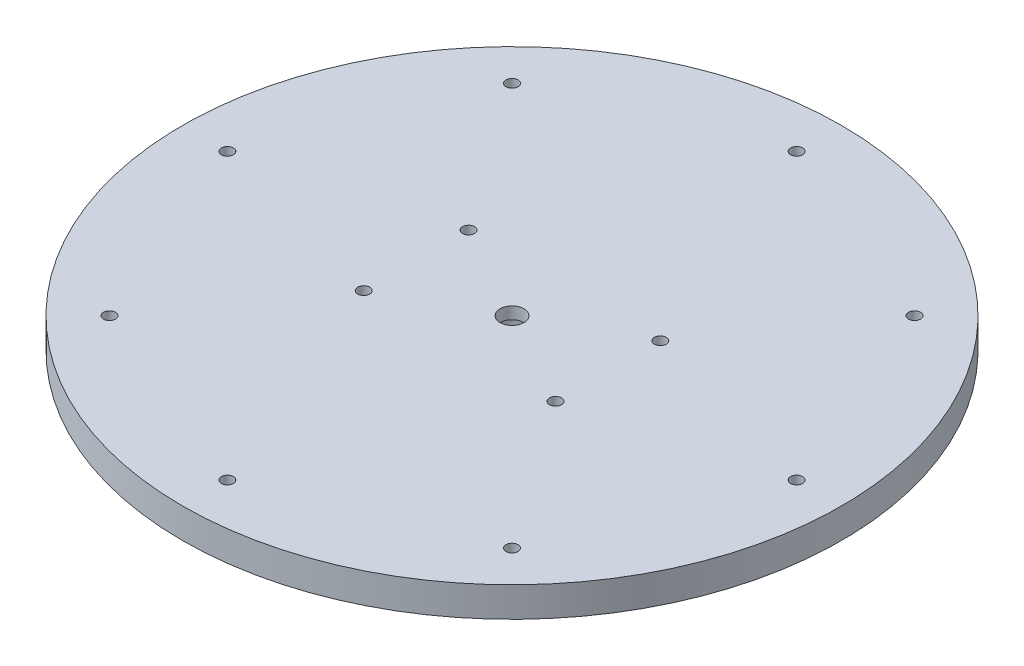
ISO-10303-21;
HEADER;
FILE_DESCRIPTION(('STEP AP214'),'2;1');
FILE_NAME('part.step','',(''),(''),'','','');
FILE_SCHEMA(('AUTOMOTIVE_DESIGN { 1 0 10303 214 1 1 1 1 }'));
ENDSEC;
DATA;
#1=APPLICATION_CONTEXT('core data for automotive mechanical design processes');
#2=APPLICATION_PROTOCOL_DEFINITION('international standard','automotive_design',2000,#1);
#3=PRODUCT_CONTEXT('',#1,'mechanical');
#4=PRODUCT('Part','Part','',(#3));
#5=PRODUCT_RELATED_PRODUCT_CATEGORY('part','',(#4));
#6=PRODUCT_DEFINITION_FORMATION('','',#4);
#7=PRODUCT_DEFINITION_CONTEXT('part definition',#1,'design');
#8=PRODUCT_DEFINITION('design','',#6,#7);
#9=PRODUCT_DEFINITION_SHAPE('','',#8);
#10=(LENGTH_UNIT() NAMED_UNIT(*) SI_UNIT(.MILLI.,.METRE.));
#11=(NAMED_UNIT(*) PLANE_ANGLE_UNIT() SI_UNIT($,.RADIAN.));
#12=(NAMED_UNIT(*) SI_UNIT($,.STERADIAN.) SOLID_ANGLE_UNIT());
#13=UNCERTAINTY_MEASURE_WITH_UNIT(LENGTH_MEASURE(1.E-05),#10,'distance_accuracy_value','');
#14=(GEOMETRIC_REPRESENTATION_CONTEXT(3) GLOBAL_UNCERTAINTY_ASSIGNED_CONTEXT((#13)) GLOBAL_UNIT_ASSIGNED_CONTEXT((#10,
#11,#12)) REPRESENTATION_CONTEXT('',''));
#15=CARTESIAN_POINT('',(0.,0.,0.));
#16=DIRECTION('',(0.,0.,1.));
#17=DIRECTION('',(1.,0.,0.));
#18=AXIS2_PLACEMENT_3D('',#15,#16,#17);
#19=CARTESIAN_POINT('',(0.,10.,0.));
#20=DIRECTION('',(0.,-1.,0.));
#21=DIRECTION('',(0.,0.,-1.));
#22=AXIS2_PLACEMENT_3D('',#19,#20,#21);
#23=CYLINDRICAL_SURFACE('',#22,110.);
#24=CARTESIAN_POINT('',(0.,10.,0.));
#25=DIRECTION('',(0.,1.,0.));
#26=DIRECTION('',(0.,0.,1.));
#27=AXIS2_PLACEMENT_3D('',#24,#25,#26);
#28=CIRCLE('',#27,110.);
#29=CARTESIAN_POINT('',(0.,10.,110.));
#30=VERTEX_POINT('',#29);
#31=EDGE_CURVE('E10',#30,#30,#28,.T.);
#32=ORIENTED_EDGE('',*,*,#31,.F.);
#33=EDGE_LOOP('',(#32));
#34=FACE_BOUND('',#33,.T.);
#35=CARTESIAN_POINT('',(0.,0.,0.));
#36=DIRECTION('',(0.,1.,0.));
#37=DIRECTION('',(0.,0.,1.));
#38=AXIS2_PLACEMENT_3D('',#35,#36,#37);
#39=CIRCLE('',#38,110.);
#40=CARTESIAN_POINT('',(0.,0.,110.));
#41=VERTEX_POINT('',#40);
#42=EDGE_CURVE('E42',#41,#41,#39,.T.);
#43=ORIENTED_EDGE('',*,*,#42,.T.);
#44=EDGE_LOOP('',(#43));
#45=FACE_BOUND('',#44,.T.);
#46=ADVANCED_FACE('F39',(#34,#45),#23,.T.);
#47=CARTESIAN_POINT('',(0.,10.,0.));
#48=DIRECTION('',(0.,1.,0.));
#49=DIRECTION('',(0.,0.,1.));
#50=AXIS2_PLACEMENT_3D('',#47,#48,#49);
#51=PLANE('',#50);
#52=CARTESIAN_POINT('',(0.,10.,95.));
#53=DIRECTION('',(0.,-1.,0.));
#54=DIRECTION('',(0.,0.,-1.));
#55=AXIS2_PLACEMENT_3D('',#52,#53,#54);
#56=CIRCLE('',#55,2.);
#57=CARTESIAN_POINT('',(0.,10.,93.));
#58=VERTEX_POINT('',#57);
#59=EDGE_CURVE('E84',#58,#58,#56,.T.);
#60=ORIENTED_EDGE('',*,*,#59,.T.);
#61=EDGE_LOOP('',(#60));
#62=FACE_BOUND('',#61,.T.);
#63=CARTESIAN_POINT('',(67.1751442127244,10.,67.1751442127277));
#64=DIRECTION('',(0.,-1.,0.));
#65=DIRECTION('',(0.,0.,-1.));
#66=AXIS2_PLACEMENT_3D('',#63,#64,#65);
#67=CIRCLE('',#66,2.00000000000076);
#68=CARTESIAN_POINT('',(67.1751442127244,10.,65.175144212727));
#69=VERTEX_POINT('',#68);
#70=EDGE_CURVE('E126',#69,#69,#67,.T.);
#71=ORIENTED_EDGE('',*,*,#70,.T.);
#72=EDGE_LOOP('',(#71));
#73=FACE_BOUND('',#72,.T.);
#74=CARTESIAN_POINT('',(95.0000000000081,10.,8.08273597077729E-12));
#75=DIRECTION('',(0.,-1.,0.));
#76=DIRECTION('',(0.,0.,-1.));
#77=AXIS2_PLACEMENT_3D('',#74,#75,#76);
#78=CIRCLE('',#77,2.00000000000569);
#79=CARTESIAN_POINT('',(95.0000000000081,10.,-1.99999999999761));
#80=VERTEX_POINT('',#79);
#81=EDGE_CURVE('E120',#80,#80,#78,.T.);
#82=ORIENTED_EDGE('',*,*,#81,.T.);
#83=EDGE_LOOP('',(#82));
#84=FACE_BOUND('',#83,.T.);
#85=CARTESIAN_POINT('',(67.1751442127358,10.,-67.1751442127163));
#86=DIRECTION('',(0.,-1.,0.));
#87=DIRECTION('',(0.,0.,-1.));
#88=AXIS2_PLACEMENT_3D('',#85,#86,#87);
#89=CIRCLE('',#88,2.000000000012);
#90=CARTESIAN_POINT('',(67.1751442127358,10.,-69.1751442127283));
#91=VERTEX_POINT('',#90);
#92=EDGE_CURVE('E114',#91,#91,#89,.T.);
#93=ORIENTED_EDGE('',*,*,#92,.T.);
#94=EDGE_LOOP('',(#93));
#95=FACE_BOUND('',#94,.T.);
#96=CARTESIAN_POINT('',(1.61654719415546E-11,10.,-95.));
#97=DIRECTION('',(0.,-1.,0.));
#98=DIRECTION('',(0.,0.,-1.));
#99=AXIS2_PLACEMENT_3D('',#96,#97,#98);
#100=CIRCLE('',#99,2.00000000001609);
#101=CARTESIAN_POINT('',(1.61654719415546E-11,10.,-97.0000000000161));
#102=VERTEX_POINT('',#101);
#103=EDGE_CURVE('E108',#102,#102,#100,.T.);
#104=ORIENTED_EDGE('',*,*,#103,.T.);
#105=EDGE_LOOP('',(#104));
#106=FACE_BOUND('',#105,.T.);
#107=CARTESIAN_POINT('',(-67.1751442127082,10.,-67.1751442127277));
#108=DIRECTION('',(0.,-1.,0.));
#109=DIRECTION('',(0.,0.,-1.));
#110=AXIS2_PLACEMENT_3D('',#107,#108,#109);
#111=CIRCLE('',#110,2.00000000001567);
#112=CARTESIAN_POINT('',(-67.1751442127082,10.,-69.1751442127434));
#113=VERTEX_POINT('',#112);
#114=EDGE_CURVE('E102',#113,#113,#111,.T.);
#115=ORIENTED_EDGE('',*,*,#114,.T.);
#116=EDGE_LOOP('',(#115));
#117=FACE_BOUND('',#116,.T.);
#118=CARTESIAN_POINT('',(-94.9999999999919,10.,-8.09437011536919E-12));
#119=DIRECTION('',(0.,-1.,0.));
#120=DIRECTION('',(0.,0.,-1.));
#121=AXIS2_PLACEMENT_3D('',#118,#119,#120);
#122=CIRCLE('',#121,2.00000000001106);
#123=CARTESIAN_POINT('',(-94.9999999999919,10.,-2.00000000001915));
#124=VERTEX_POINT('',#123);
#125=EDGE_CURVE('E96',#124,#124,#122,.T.);
#126=ORIENTED_EDGE('',*,*,#125,.T.);
#127=EDGE_LOOP('',(#126));
#128=FACE_BOUND('',#127,.T.);
#129=CARTESIAN_POINT('',(-67.1751442127197,10.,67.1751442127163));
#130=DIRECTION('',(0.,-1.,0.));
#131=DIRECTION('',(0.,0.,-1.));
#132=AXIS2_PLACEMENT_3D('',#129,#130,#131);
#133=CIRCLE('',#132,2.00000000000508);
#134=CARTESIAN_POINT('',(-67.1751442127197,10.,65.1751442127112));
#135=VERTEX_POINT('',#134);
#136=EDGE_CURVE('E90',#135,#135,#133,.T.);
#137=ORIENTED_EDGE('',*,*,#136,.T.);
#138=EDGE_LOOP('',(#137));
#139=FACE_BOUND('',#138,.T.);
#140=CARTESIAN_POINT('',(-32.,10.,-17.5));
#141=DIRECTION('',(0.,-1.,0.));
#142=DIRECTION('',(0.,0.,-1.));
#143=AXIS2_PLACEMENT_3D('',#140,#141,#142);
#144=CIRCLE('',#143,2.);
#145=CARTESIAN_POINT('',(-32.,10.,-19.5));
#146=VERTEX_POINT('',#145);
#147=EDGE_CURVE('E76',#146,#146,#144,.T.);
#148=ORIENTED_EDGE('',*,*,#147,.T.);
#149=EDGE_LOOP('',(#148));
#150=FACE_BOUND('',#149,.T.);
#151=CARTESIAN_POINT('',(32.,10.,17.5));
#152=DIRECTION('',(0.,-1.,0.));
#153=DIRECTION('',(0.,0.,-1.));
#154=AXIS2_PLACEMENT_3D('',#151,#152,#153);
#155=CIRCLE('',#154,2.);
#156=CARTESIAN_POINT('',(32.,10.,15.5));
#157=VERTEX_POINT('',#156);
#158=EDGE_CURVE('E69',#157,#157,#155,.T.);
#159=ORIENTED_EDGE('',*,*,#158,.T.);
#160=EDGE_LOOP('',(#159));
#161=FACE_BOUND('',#160,.T.);
#162=CARTESIAN_POINT('',(32.,10.,-17.5));
#163=DIRECTION('',(0.,-1.,0.));
#164=DIRECTION('',(0.,0.,-1.));
#165=AXIS2_PLACEMENT_3D('',#162,#163,#164);
#166=CIRCLE('',#165,2.);
#167=CARTESIAN_POINT('',(32.,10.,-19.5));
#168=VERTEX_POINT('',#167);
#169=EDGE_CURVE('E81',#168,#168,#166,.T.);
#170=ORIENTED_EDGE('',*,*,#169,.T.);
#171=EDGE_LOOP('',(#170));
#172=FACE_BOUND('',#171,.T.);
#173=CARTESIAN_POINT('',(-32.,10.,17.5));
#174=DIRECTION('',(0.,-1.,0.));
#175=DIRECTION('',(0.,0.,-1.));
#176=AXIS2_PLACEMENT_3D('',#173,#174,#175);
#177=CIRCLE('',#176,2.);
#178=CARTESIAN_POINT('',(-32.,10.,15.5));
#179=VERTEX_POINT('',#178);
#180=EDGE_CURVE('E60',#179,#179,#177,.T.);
#181=ORIENTED_EDGE('',*,*,#180,.T.);
#182=EDGE_LOOP('',(#181));
#183=FACE_BOUND('',#182,.T.);
#184=CARTESIAN_POINT('',(0.,10.,0.));
#185=DIRECTION('',(0.,-1.,0.));
#186=DIRECTION('',(0.,0.,-1.));
#187=AXIS2_PLACEMENT_3D('',#184,#185,#186);
#188=CIRCLE('',#187,4.);
#189=CARTESIAN_POINT('',(0.,10.,-4.));
#190=VERTEX_POINT('',#189);
#191=EDGE_CURVE('E54',#190,#190,#188,.T.);
#192=ORIENTED_EDGE('',*,*,#191,.T.);
#193=EDGE_LOOP('',(#192));
#194=FACE_BOUND('',#193,.T.);
#195=ORIENTED_EDGE('',*,*,#31,.T.);
#196=EDGE_LOOP('',(#195));
#197=FACE_BOUND('',#196,.T.);
#198=ADVANCED_FACE('F135',(#62,#73,#84,#95,#106,#117,#128,#139,#150,#161,#172,#183,#194,#197),
#51,.T.);
#199=CARTESIAN_POINT('',(0.,0.,0.));
#200=DIRECTION('',(0.,1.,0.));
#201=DIRECTION('',(0.,0.,1.));
#202=AXIS2_PLACEMENT_3D('',#199,#200,#201);
#203=PLANE('',#202);
#204=CARTESIAN_POINT('',(0.,0.,95.));
#205=DIRECTION('',(0.,-1.,0.));
#206=DIRECTION('',(0.,0.,-1.));
#207=AXIS2_PLACEMENT_3D('',#204,#205,#206);
#208=CIRCLE('',#207,2.);
#209=CARTESIAN_POINT('',(0.,0.,93.));
#210=VERTEX_POINT('',#209);
#211=EDGE_CURVE('E129',#210,#210,#208,.T.);
#212=ORIENTED_EDGE('',*,*,#211,.F.);
#213=EDGE_LOOP('',(#212));
#214=FACE_BOUND('',#213,.T.);
#215=CARTESIAN_POINT('',(67.1751442127244,0.,67.1751442127277));
#216=DIRECTION('',(0.,-1.,0.));
#217=DIRECTION('',(0.,0.,-1.));
#218=AXIS2_PLACEMENT_3D('',#215,#216,#217);
#219=CIRCLE('',#218,2.00000000000076);
#220=CARTESIAN_POINT('',(67.1751442127244,0.,65.175144212727));
#221=VERTEX_POINT('',#220);
#222=EDGE_CURVE('E123',#221,#221,#219,.T.);
#223=ORIENTED_EDGE('',*,*,#222,.F.);
#224=EDGE_LOOP('',(#223));
#225=FACE_BOUND('',#224,.T.);
#226=CARTESIAN_POINT('',(95.0000000000081,0.,8.08273597077729E-12));
#227=DIRECTION('',(0.,-1.,0.));
#228=DIRECTION('',(0.,0.,-1.));
#229=AXIS2_PLACEMENT_3D('',#226,#227,#228);
#230=CIRCLE('',#229,2.00000000000569);
#231=CARTESIAN_POINT('',(95.0000000000081,0.,-1.99999999999761));
#232=VERTEX_POINT('',#231);
#233=EDGE_CURVE('E117',#232,#232,#230,.T.);
#234=ORIENTED_EDGE('',*,*,#233,.F.);
#235=EDGE_LOOP('',(#234));
#236=FACE_BOUND('',#235,.T.);
#237=CARTESIAN_POINT('',(67.1751442127358,0.,-67.1751442127163));
#238=DIRECTION('',(0.,-1.,0.));
#239=DIRECTION('',(0.,0.,-1.));
#240=AXIS2_PLACEMENT_3D('',#237,#238,#239);
#241=CIRCLE('',#240,2.000000000012);
#242=CARTESIAN_POINT('',(67.1751442127358,0.,-69.1751442127283));
#243=VERTEX_POINT('',#242);
#244=EDGE_CURVE('E111',#243,#243,#241,.T.);
#245=ORIENTED_EDGE('',*,*,#244,.F.);
#246=EDGE_LOOP('',(#245));
#247=FACE_BOUND('',#246,.T.);
#248=CARTESIAN_POINT('',(1.61654719415546E-11,0.,-95.));
#249=DIRECTION('',(0.,-1.,0.));
#250=DIRECTION('',(0.,0.,-1.));
#251=AXIS2_PLACEMENT_3D('',#248,#249,#250);
#252=CIRCLE('',#251,2.00000000001609);
#253=CARTESIAN_POINT('',(1.61654719415546E-11,0.,-97.0000000000161));
#254=VERTEX_POINT('',#253);
#255=EDGE_CURVE('E105',#254,#254,#252,.T.);
#256=ORIENTED_EDGE('',*,*,#255,.F.);
#257=EDGE_LOOP('',(#256));
#258=FACE_BOUND('',#257,.T.);
#259=CARTESIAN_POINT('',(-67.1751442127082,0.,-67.1751442127277));
#260=DIRECTION('',(0.,-1.,0.));
#261=DIRECTION('',(0.,0.,-1.));
#262=AXIS2_PLACEMENT_3D('',#259,#260,#261);
#263=CIRCLE('',#262,2.00000000001567);
#264=CARTESIAN_POINT('',(-67.1751442127082,0.,-69.1751442127434));
#265=VERTEX_POINT('',#264);
#266=EDGE_CURVE('E99',#265,#265,#263,.T.);
#267=ORIENTED_EDGE('',*,*,#266,.F.);
#268=EDGE_LOOP('',(#267));
#269=FACE_BOUND('',#268,.T.);
#270=CARTESIAN_POINT('',(-94.9999999999919,0.,-8.09437011536919E-12));
#271=DIRECTION('',(0.,-1.,0.));
#272=DIRECTION('',(0.,0.,-1.));
#273=AXIS2_PLACEMENT_3D('',#270,#271,#272);
#274=CIRCLE('',#273,2.00000000001106);
#275=CARTESIAN_POINT('',(-94.9999999999919,0.,-2.00000000001915));
#276=VERTEX_POINT('',#275);
#277=EDGE_CURVE('E93',#276,#276,#274,.T.);
#278=ORIENTED_EDGE('',*,*,#277,.F.);
#279=EDGE_LOOP('',(#278));
#280=FACE_BOUND('',#279,.T.);
#281=CARTESIAN_POINT('',(-67.1751442127197,0.,67.1751442127163));
#282=DIRECTION('',(0.,-1.,0.));
#283=DIRECTION('',(0.,0.,-1.));
#284=AXIS2_PLACEMENT_3D('',#281,#282,#283);
#285=CIRCLE('',#284,2.00000000000508);
#286=CARTESIAN_POINT('',(-67.1751442127197,0.,65.1751442127112));
#287=VERTEX_POINT('',#286);
#288=EDGE_CURVE('E87',#287,#287,#285,.T.);
#289=ORIENTED_EDGE('',*,*,#288,.F.);
#290=EDGE_LOOP('',(#289));
#291=FACE_BOUND('',#290,.T.);
#292=CARTESIAN_POINT('',(-32.,0.,-17.5));
#293=DIRECTION('',(0.,-1.,0.));
#294=DIRECTION('',(0.,0.,-1.));
#295=AXIS2_PLACEMENT_3D('',#292,#293,#294);
#296=CIRCLE('',#295,2.);
#297=CARTESIAN_POINT('',(-32.,0.,-19.5));
#298=VERTEX_POINT('',#297);
#299=EDGE_CURVE('E66',#298,#298,#296,.T.);
#300=ORIENTED_EDGE('',*,*,#299,.F.);
#301=EDGE_LOOP('',(#300));
#302=FACE_BOUND('',#301,.T.);
#303=CARTESIAN_POINT('',(32.,0.,17.5));
#304=DIRECTION('',(0.,-1.,0.));
#305=DIRECTION('',(0.,0.,-1.));
#306=AXIS2_PLACEMENT_3D('',#303,#304,#305);
#307=CIRCLE('',#306,2.);
#308=CARTESIAN_POINT('',(32.,0.,15.5));
#309=VERTEX_POINT('',#308);
#310=EDGE_CURVE('E72',#309,#309,#307,.T.);
#311=ORIENTED_EDGE('',*,*,#310,.F.);
#312=EDGE_LOOP('',(#311));
#313=FACE_BOUND('',#312,.T.);
#314=CARTESIAN_POINT('',(32.,0.,-17.5));
#315=DIRECTION('',(0.,-1.,0.));
#316=DIRECTION('',(0.,0.,-1.));
#317=AXIS2_PLACEMENT_3D('',#314,#315,#316);
#318=CIRCLE('',#317,2.);
#319=CARTESIAN_POINT('',(32.,0.,-19.5));
#320=VERTEX_POINT('',#319);
#321=EDGE_CURVE('E73',#320,#320,#318,.T.);
#322=ORIENTED_EDGE('',*,*,#321,.F.);
#323=EDGE_LOOP('',(#322));
#324=FACE_BOUND('',#323,.T.);
#325=CARTESIAN_POINT('',(-32.,0.,17.5));
#326=DIRECTION('',(0.,-1.,0.));
#327=DIRECTION('',(0.,0.,-1.));
#328=AXIS2_PLACEMENT_3D('',#325,#326,#327);
#329=CIRCLE('',#328,2.);
#330=CARTESIAN_POINT('',(-32.,0.,15.5));
#331=VERTEX_POINT('',#330);
#332=EDGE_CURVE('E63',#331,#331,#329,.T.);
#333=ORIENTED_EDGE('',*,*,#332,.F.);
#334=EDGE_LOOP('',(#333));
#335=FACE_BOUND('',#334,.T.);
#336=CARTESIAN_POINT('',(0.,0.,0.));
#337=DIRECTION('',(0.,-1.,0.));
#338=DIRECTION('',(0.,0.,-1.));
#339=AXIS2_PLACEMENT_3D('',#336,#337,#338);
#340=CIRCLE('',#339,9.5);
#341=CARTESIAN_POINT('',(0.,0.,-9.5));
#342=VERTEX_POINT('',#341);
#343=EDGE_CURVE('E51',#342,#342,#340,.T.);
#344=ORIENTED_EDGE('',*,*,#343,.F.);
#345=EDGE_LOOP('',(#344));
#346=FACE_BOUND('',#345,.T.);
#347=ORIENTED_EDGE('',*,*,#42,.F.);
#348=EDGE_LOOP('',(#347));
#349=FACE_BOUND('',#348,.T.);
#350=ADVANCED_FACE('F145',(#214,#225,#236,#247,#258,#269,#280,#291,#302,#313,#324,#335,#346,
#349),#203,.F.);
#351=CARTESIAN_POINT('',(0.,6.,0.));
#352=DIRECTION('',(0.,-1.,0.));
#353=DIRECTION('',(0.,0.,-1.));
#354=AXIS2_PLACEMENT_3D('',#351,#352,#353);
#355=CYLINDRICAL_SURFACE('',#354,9.5);
#356=CARTESIAN_POINT('',(0.,6.,0.));
#357=DIRECTION('',(0.,-1.,0.));
#358=DIRECTION('',(0.,0.,-1.));
#359=AXIS2_PLACEMENT_3D('',#356,#357,#358);
#360=CIRCLE('',#359,9.5);
#361=CARTESIAN_POINT('',(0.,6.,-9.5));
#362=VERTEX_POINT('',#361);
#363=EDGE_CURVE('E49',#362,#362,#360,.T.);
#364=ORIENTED_EDGE('',*,*,#363,.F.);
#365=EDGE_LOOP('',(#364));
#366=FACE_BOUND('',#365,.T.);
#367=ORIENTED_EDGE('',*,*,#343,.T.);
#368=EDGE_LOOP('',(#367));
#369=FACE_BOUND('',#368,.T.);
#370=ADVANCED_FACE('F148',(#366,#369),#355,.F.);
#371=CARTESIAN_POINT('',(0.,6.,0.));
#372=DIRECTION('',(0.,-1.,0.));
#373=DIRECTION('',(0.,0.,-1.));
#374=AXIS2_PLACEMENT_3D('',#371,#372,#373);
#375=PLANE('',#374);
#376=CARTESIAN_POINT('',(0.,6.,0.));
#377=DIRECTION('',(0.,-1.,0.));
#378=DIRECTION('',(0.,0.,-1.));
#379=AXIS2_PLACEMENT_3D('',#376,#377,#378);
#380=CIRCLE('',#379,4.);
#381=CARTESIAN_POINT('',(0.,6.,-4.));
#382=VERTEX_POINT('',#381);
#383=EDGE_CURVE('E57',#382,#382,#380,.T.);
#384=ORIENTED_EDGE('',*,*,#383,.F.);
#385=EDGE_LOOP('',(#384));
#386=FACE_BOUND('',#385,.T.);
#387=ORIENTED_EDGE('',*,*,#363,.T.);
#388=EDGE_LOOP('',(#387));
#389=FACE_BOUND('',#388,.T.);
#390=ADVANCED_FACE('F186',(#386,#389),#375,.T.);
#391=CARTESIAN_POINT('',(0.,10.,0.));
#392=DIRECTION('',(0.,-1.,0.));
#393=DIRECTION('',(0.,0.,-1.));
#394=AXIS2_PLACEMENT_3D('',#391,#392,#393);
#395=CYLINDRICAL_SURFACE('',#394,4.);
#396=ORIENTED_EDGE('',*,*,#191,.F.);
#397=EDGE_LOOP('',(#396));
#398=FACE_BOUND('',#397,.T.);
#399=ORIENTED_EDGE('',*,*,#383,.T.);
#400=EDGE_LOOP('',(#399));
#401=FACE_BOUND('',#400,.T.);
#402=ADVANCED_FACE('F190',(#398,#401),#395,.F.);
#403=CARTESIAN_POINT('',(-32.,10.,17.5));
#404=DIRECTION('',(0.,-1.,0.));
#405=DIRECTION('',(0.,0.,-1.));
#406=AXIS2_PLACEMENT_3D('',#403,#404,#405);
#407=CYLINDRICAL_SURFACE('',#406,2.);
#408=ORIENTED_EDGE('',*,*,#180,.F.);
#409=EDGE_LOOP('',(#408));
#410=FACE_BOUND('',#409,.T.);
#411=ORIENTED_EDGE('',*,*,#332,.T.);
#412=EDGE_LOOP('',(#411));
#413=FACE_BOUND('',#412,.T.);
#414=ADVANCED_FACE('F194',(#410,#413),#407,.F.);
#415=CARTESIAN_POINT('',(32.,10.,-17.5));
#416=DIRECTION('',(0.,-1.,0.));
#417=DIRECTION('',(0.,0.,-1.));
#418=AXIS2_PLACEMENT_3D('',#415,#416,#417);
#419=CYLINDRICAL_SURFACE('',#418,2.);
#420=ORIENTED_EDGE('',*,*,#169,.F.);
#421=EDGE_LOOP('',(#420));
#422=FACE_BOUND('',#421,.T.);
#423=ORIENTED_EDGE('',*,*,#321,.T.);
#424=EDGE_LOOP('',(#423));
#425=FACE_BOUND('',#424,.T.);
#426=ADVANCED_FACE('F198',(#422,#425),#419,.F.);
#427=CARTESIAN_POINT('',(32.,10.,17.5));
#428=DIRECTION('',(0.,-1.,0.));
#429=DIRECTION('',(0.,0.,-1.));
#430=AXIS2_PLACEMENT_3D('',#427,#428,#429);
#431=CYLINDRICAL_SURFACE('',#430,2.);
#432=ORIENTED_EDGE('',*,*,#158,.F.);
#433=EDGE_LOOP('',(#432));
#434=FACE_BOUND('',#433,.T.);
#435=ORIENTED_EDGE('',*,*,#310,.T.);
#436=EDGE_LOOP('',(#435));
#437=FACE_BOUND('',#436,.T.);
#438=ADVANCED_FACE('F200',(#434,#437),#431,.F.);
#439=CARTESIAN_POINT('',(-32.,10.,-17.5));
#440=DIRECTION('',(0.,-1.,0.));
#441=DIRECTION('',(0.,0.,-1.));
#442=AXIS2_PLACEMENT_3D('',#439,#440,#441);
#443=CYLINDRICAL_SURFACE('',#442,2.);
#444=ORIENTED_EDGE('',*,*,#147,.F.);
#445=EDGE_LOOP('',(#444));
#446=FACE_BOUND('',#445,.T.);
#447=ORIENTED_EDGE('',*,*,#299,.T.);
#448=EDGE_LOOP('',(#447));
#449=FACE_BOUND('',#448,.T.);
#450=ADVANCED_FACE('F203',(#446,#449),#443,.F.);
#451=CARTESIAN_POINT('',(-67.1751442127197,10.,67.1751442127163));
#452=DIRECTION('',(0.,-1.,0.));
#453=DIRECTION('',(0.,0.,-1.));
#454=AXIS2_PLACEMENT_3D('',#451,#452,#453);
#455=CYLINDRICAL_SURFACE('',#454,2.00000000000508);
#456=ORIENTED_EDGE('',*,*,#136,.F.);
#457=EDGE_LOOP('',(#456));
#458=FACE_BOUND('',#457,.T.);
#459=ORIENTED_EDGE('',*,*,#288,.T.);
#460=EDGE_LOOP('',(#459));
#461=FACE_BOUND('',#460,.T.);
#462=ADVANCED_FACE('F207',(#458,#461),#455,.F.);
#463=CARTESIAN_POINT('',(-94.9999999999919,10.,-8.09437011536919E-12));
#464=DIRECTION('',(0.,-1.,0.));
#465=DIRECTION('',(0.,0.,-1.));
#466=AXIS2_PLACEMENT_3D('',#463,#464,#465);
#467=CYLINDRICAL_SURFACE('',#466,2.00000000001106);
#468=ORIENTED_EDGE('',*,*,#125,.F.);
#469=EDGE_LOOP('',(#468));
#470=FACE_BOUND('',#469,.T.);
#471=ORIENTED_EDGE('',*,*,#277,.T.);
#472=EDGE_LOOP('',(#471));
#473=FACE_BOUND('',#472,.T.);
#474=ADVANCED_FACE('F214',(#470,#473),#467,.F.);
#475=CARTESIAN_POINT('',(-67.1751442127082,10.,-67.1751442127277));
#476=DIRECTION('',(0.,-1.,0.));
#477=DIRECTION('',(0.,0.,-1.));
#478=AXIS2_PLACEMENT_3D('',#475,#476,#477);
#479=CYLINDRICAL_SURFACE('',#478,2.00000000001567);
#480=ORIENTED_EDGE('',*,*,#114,.F.);
#481=EDGE_LOOP('',(#480));
#482=FACE_BOUND('',#481,.T.);
#483=ORIENTED_EDGE('',*,*,#266,.T.);
#484=EDGE_LOOP('',(#483));
#485=FACE_BOUND('',#484,.T.);
#486=ADVANCED_FACE('F218',(#482,#485),#479,.F.);
#487=CARTESIAN_POINT('',(1.61654719415546E-11,10.,-95.));
#488=DIRECTION('',(0.,-1.,0.));
#489=DIRECTION('',(0.,0.,-1.));
#490=AXIS2_PLACEMENT_3D('',#487,#488,#489);
#491=CYLINDRICAL_SURFACE('',#490,2.00000000001609);
#492=ORIENTED_EDGE('',*,*,#103,.F.);
#493=EDGE_LOOP('',(#492));
#494=FACE_BOUND('',#493,.T.);
#495=ORIENTED_EDGE('',*,*,#255,.T.);
#496=EDGE_LOOP('',(#495));
#497=FACE_BOUND('',#496,.T.);
#498=ADVANCED_FACE('F222',(#494,#497),#491,.F.);
#499=CARTESIAN_POINT('',(67.1751442127358,10.,-67.1751442127163));
#500=DIRECTION('',(0.,-1.,0.));
#501=DIRECTION('',(0.,0.,-1.));
#502=AXIS2_PLACEMENT_3D('',#499,#500,#501);
#503=CYLINDRICAL_SURFACE('',#502,2.000000000012);
#504=ORIENTED_EDGE('',*,*,#92,.F.);
#505=EDGE_LOOP('',(#504));
#506=FACE_BOUND('',#505,.T.);
#507=ORIENTED_EDGE('',*,*,#244,.T.);
#508=EDGE_LOOP('',(#507));
#509=FACE_BOUND('',#508,.T.);
#510=ADVANCED_FACE('F226',(#506,#509),#503,.F.);
#511=CARTESIAN_POINT('',(95.0000000000081,10.,8.08273597077729E-12));
#512=DIRECTION('',(0.,-1.,0.));
#513=DIRECTION('',(0.,0.,-1.));
#514=AXIS2_PLACEMENT_3D('',#511,#512,#513);
#515=CYLINDRICAL_SURFACE('',#514,2.00000000000569);
#516=ORIENTED_EDGE('',*,*,#81,.F.);
#517=EDGE_LOOP('',(#516));
#518=FACE_BOUND('',#517,.T.);
#519=ORIENTED_EDGE('',*,*,#233,.T.);
#520=EDGE_LOOP('',(#519));
#521=FACE_BOUND('',#520,.T.);
#522=ADVANCED_FACE('F230',(#518,#521),#515,.F.);
#523=CARTESIAN_POINT('',(67.1751442127244,10.,67.1751442127277));
#524=DIRECTION('',(0.,-1.,0.));
#525=DIRECTION('',(0.,0.,-1.));
#526=AXIS2_PLACEMENT_3D('',#523,#524,#525);
#527=CYLINDRICAL_SURFACE('',#526,2.00000000000076);
#528=ORIENTED_EDGE('',*,*,#70,.F.);
#529=EDGE_LOOP('',(#528));
#530=FACE_BOUND('',#529,.T.);
#531=ORIENTED_EDGE('',*,*,#222,.T.);
#532=EDGE_LOOP('',(#531));
#533=FACE_BOUND('',#532,.T.);
#534=ADVANCED_FACE('F141',(#530,#533),#527,.F.);
#535=CARTESIAN_POINT('',(0.,10.,95.));
#536=DIRECTION('',(0.,-1.,0.));
#537=DIRECTION('',(0.,0.,-1.));
#538=AXIS2_PLACEMENT_3D('',#535,#536,#537);
#539=CYLINDRICAL_SURFACE('',#538,2.);
#540=ORIENTED_EDGE('',*,*,#59,.F.);
#541=EDGE_LOOP('',(#540));
#542=FACE_BOUND('',#541,.T.);
#543=ORIENTED_EDGE('',*,*,#211,.T.);
#544=EDGE_LOOP('',(#543));
#545=FACE_BOUND('',#544,.T.);
#546=ADVANCED_FACE('F138',(#542,#545),#539,.F.);
#547=CLOSED_SHELL('',(#46,#198,#350,#370,#390,#402,#414,#426,#438,#450,#462,#474,#486,#498,#510,
#522,#534,#546));
#548=MANIFOLD_SOLID_BREP('B2',#547);
#549=ADVANCED_BREP_SHAPE_REPRESENTATION('',(#18,#548),#14);
#550=SHAPE_DEFINITION_REPRESENTATION(#9,#549);
ENDSEC;
END-ISO-10303-21;
